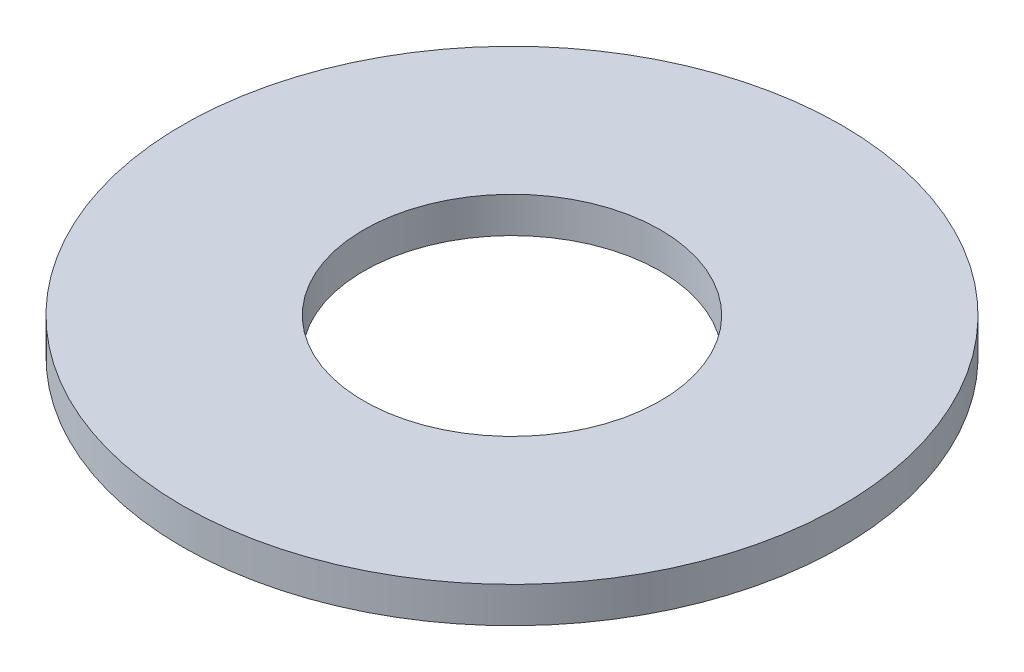
ISO-10303-21;
HEADER;
FILE_DESCRIPTION(('STEP AP214'),'2;1');
FILE_NAME('part.step','',(''),(''),'','','');
FILE_SCHEMA(('AUTOMOTIVE_DESIGN { 1 0 10303 214 1 1 1 1 }'));
ENDSEC;
DATA;
#1=APPLICATION_CONTEXT('core data for automotive mechanical design processes');
#2=APPLICATION_PROTOCOL_DEFINITION('international standard','automotive_design',2000,#1);
#3=PRODUCT_CONTEXT('',#1,'mechanical');
#4=PRODUCT('Part','Part','',(#3));
#5=PRODUCT_RELATED_PRODUCT_CATEGORY('part','',(#4));
#6=PRODUCT_DEFINITION_FORMATION('','',#4);
#7=PRODUCT_DEFINITION_CONTEXT('part definition',#1,'design');
#8=PRODUCT_DEFINITION('design','',#6,#7);
#9=PRODUCT_DEFINITION_SHAPE('','',#8);
#10=(LENGTH_UNIT() NAMED_UNIT(*) SI_UNIT(.MILLI.,.METRE.));
#11=(NAMED_UNIT(*) PLANE_ANGLE_UNIT() SI_UNIT($,.RADIAN.));
#12=(NAMED_UNIT(*) SI_UNIT($,.STERADIAN.) SOLID_ANGLE_UNIT());
#13=UNCERTAINTY_MEASURE_WITH_UNIT(LENGTH_MEASURE(1.E-05),#10,'distance_accuracy_value','');
#14=(GEOMETRIC_REPRESENTATION_CONTEXT(3) GLOBAL_UNCERTAINTY_ASSIGNED_CONTEXT((#13)) GLOBAL_UNIT_ASSIGNED_CONTEXT((#10,
#11,#12)) REPRESENTATION_CONTEXT('',''));
#15=CARTESIAN_POINT('',(0.,0.,0.));
#16=DIRECTION('',(0.,0.,1.));
#17=DIRECTION('',(1.,0.,0.));
#18=AXIS2_PLACEMENT_3D('',#15,#16,#17);
#19=CARTESIAN_POINT('',(0.,0.,0.));
#20=DIRECTION('',(0.,1.,0.));
#21=DIRECTION('',(0.,0.,1.));
#22=AXIS2_PLACEMENT_3D('',#19,#20,#21);
#23=PLANE('',#22);
#24=CARTESIAN_POINT('',(0.,0.,0.));
#25=DIRECTION('',(0.,-1.,0.));
#26=DIRECTION('',(0.,0.,-1.));
#27=AXIS2_PLACEMENT_3D('',#24,#25,#26);
#28=CIRCLE('',#27,1.575);
#29=CARTESIAN_POINT('',(0.,0.,-1.575));
#30=VERTEX_POINT('',#29);
#31=EDGE_CURVE('E28',#30,#30,#28,.F.);
#32=ORIENTED_EDGE('',*,*,#31,.T.);
#33=EDGE_LOOP('',(#32));
#34=FACE_BOUND('',#33,.T.);
#35=CARTESIAN_POINT('',(0.,0.,0.));
#36=DIRECTION('',(0.,-1.,0.));
#37=DIRECTION('',(0.,0.,-1.));
#38=AXIS2_PLACEMENT_3D('',#35,#36,#37);
#39=CIRCLE('',#38,3.5);
#40=CARTESIAN_POINT('',(0.,0.,-3.5));
#41=VERTEX_POINT('',#40);
#42=EDGE_CURVE('E19',#41,#41,#39,.F.);
#43=ORIENTED_EDGE('',*,*,#42,.F.);
#44=EDGE_LOOP('',(#43));
#45=FACE_BOUND('',#44,.T.);
#46=ADVANCED_FACE('F16',(#34,#45),#23,.F.);
#47=CARTESIAN_POINT('',(0.,0.38,0.));
#48=DIRECTION('',(0.,-1.,0.));
#49=DIRECTION('',(0.,0.,-1.));
#50=AXIS2_PLACEMENT_3D('',#47,#48,#49);
#51=CYLINDRICAL_SURFACE('',#50,3.5);
#52=ORIENTED_EDGE('',*,*,#42,.T.);
#53=EDGE_LOOP('',(#52));
#54=FACE_BOUND('',#53,.T.);
#55=CARTESIAN_POINT('',(0.,0.38,0.));
#56=DIRECTION('',(0.,-1.,0.));
#57=DIRECTION('',(0.,0.,-1.));
#58=AXIS2_PLACEMENT_3D('',#55,#56,#57);
#59=CIRCLE('',#58,3.5);
#60=CARTESIAN_POINT('',(0.,0.38,-3.5));
#61=VERTEX_POINT('',#60);
#62=EDGE_CURVE('E23',#61,#61,#59,.F.);
#63=ORIENTED_EDGE('',*,*,#62,.F.);
#64=EDGE_LOOP('',(#63));
#65=FACE_BOUND('',#64,.T.);
#66=ADVANCED_FACE('F36',(#54,#65),#51,.T.);
#67=CARTESIAN_POINT('',(0.,0.38,0.));
#68=DIRECTION('',(0.,-1.,0.));
#69=DIRECTION('',(0.,0.,-1.));
#70=AXIS2_PLACEMENT_3D('',#67,#68,#69);
#71=CYLINDRICAL_SURFACE('',#70,1.575);
#72=CARTESIAN_POINT('',(0.,0.38,0.));
#73=DIRECTION('',(0.,-1.,0.));
#74=DIRECTION('',(0.,0.,-1.));
#75=AXIS2_PLACEMENT_3D('',#72,#73,#74);
#76=CIRCLE('',#75,1.575);
#77=CARTESIAN_POINT('',(0.,0.38,-1.575));
#78=VERTEX_POINT('',#77);
#79=EDGE_CURVE('E10',#78,#78,#76,.T.);
#80=ORIENTED_EDGE('',*,*,#79,.F.);
#81=EDGE_LOOP('',(#80));
#82=FACE_BOUND('',#81,.T.);
#83=ORIENTED_EDGE('',*,*,#31,.F.);
#84=EDGE_LOOP('',(#83));
#85=FACE_BOUND('',#84,.T.);
#86=ADVANCED_FACE('F43',(#82,#85),#71,.F.);
#87=CARTESIAN_POINT('',(0.,0.38,0.));
#88=DIRECTION('',(0.,1.,0.));
#89=DIRECTION('',(0.,0.,1.));
#90=AXIS2_PLACEMENT_3D('',#87,#88,#89);
#91=PLANE('',#90);
#92=ORIENTED_EDGE('',*,*,#79,.T.);
#93=EDGE_LOOP('',(#92));
#94=FACE_BOUND('',#93,.T.);
#95=ORIENTED_EDGE('',*,*,#62,.T.);
#96=EDGE_LOOP('',(#95));
#97=FACE_BOUND('',#96,.T.);
#98=ADVANCED_FACE('F44',(#94,#97),#91,.T.);
#99=CLOSED_SHELL('',(#46,#66,#86,#98));
#100=MANIFOLD_SOLID_BREP('B1',#99);
#101=ADVANCED_BREP_SHAPE_REPRESENTATION('',(#18,#100),#14);
#102=SHAPE_DEFINITION_REPRESENTATION(#9,#101);
ENDSEC;
END-ISO-10303-21;
